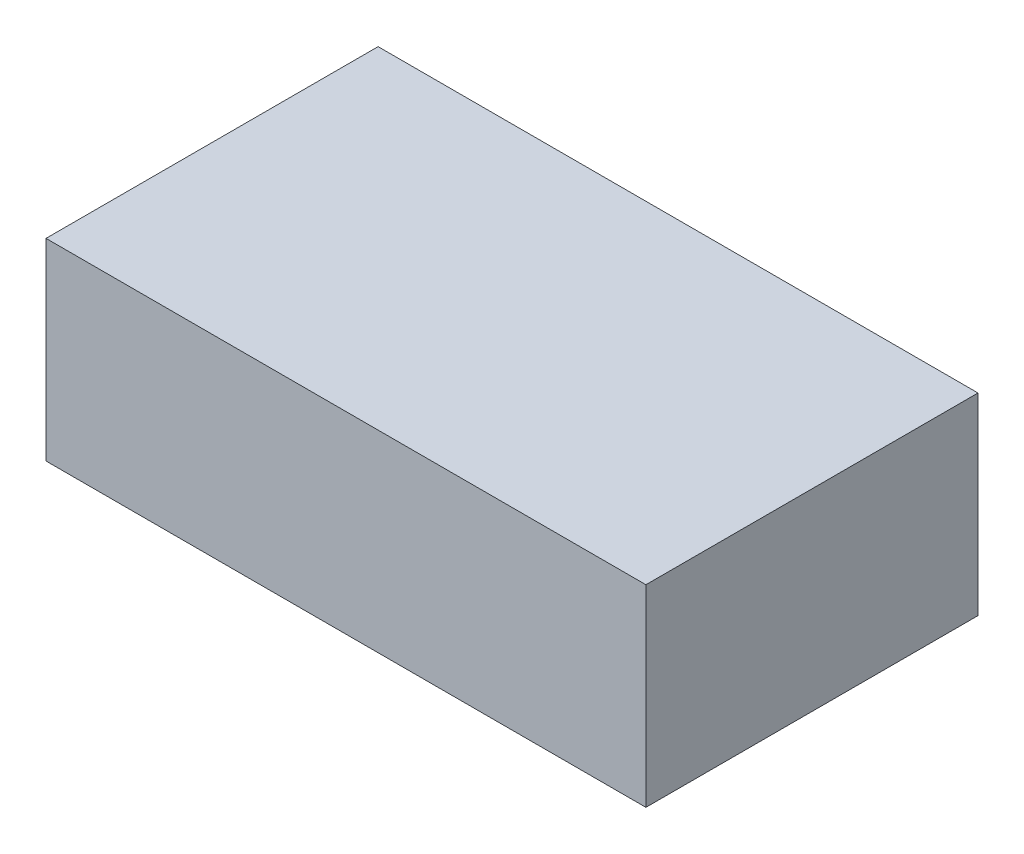
ISO-10303-21;
HEADER;
FILE_DESCRIPTION(('STEP AP214'),'2;1');
FILE_NAME('part.step','',(''),(''),'','','');
FILE_SCHEMA(('AUTOMOTIVE_DESIGN { 1 0 10303 214 1 1 1 1 }'));
ENDSEC;
DATA;
#1=APPLICATION_CONTEXT('core data for automotive mechanical design processes');
#2=APPLICATION_PROTOCOL_DEFINITION('international standard','automotive_design',2000,#1);
#3=PRODUCT_CONTEXT('',#1,'mechanical');
#4=PRODUCT('Part','Part','',(#3));
#5=PRODUCT_RELATED_PRODUCT_CATEGORY('part','',(#4));
#6=PRODUCT_DEFINITION_FORMATION('','',#4);
#7=PRODUCT_DEFINITION_CONTEXT('part definition',#1,'design');
#8=PRODUCT_DEFINITION('design','',#6,#7);
#9=PRODUCT_DEFINITION_SHAPE('','',#8);
#10=(LENGTH_UNIT() NAMED_UNIT(*) SI_UNIT(.MILLI.,.METRE.));
#11=(NAMED_UNIT(*) PLANE_ANGLE_UNIT() SI_UNIT($,.RADIAN.));
#12=(NAMED_UNIT(*) SI_UNIT($,.STERADIAN.) SOLID_ANGLE_UNIT());
#13=UNCERTAINTY_MEASURE_WITH_UNIT(LENGTH_MEASURE(1.E-05),#10,'distance_accuracy_value','');
#14=(GEOMETRIC_REPRESENTATION_CONTEXT(3) GLOBAL_UNCERTAINTY_ASSIGNED_CONTEXT((#13)) GLOBAL_UNIT_ASSIGNED_CONTEXT((#10,
#11,#12)) REPRESENTATION_CONTEXT('',''));
#15=CARTESIAN_POINT('',(0.,0.,0.));
#16=DIRECTION('',(0.,0.,1.));
#17=DIRECTION('',(1.,0.,0.));
#18=AXIS2_PLACEMENT_3D('',#15,#16,#17);
#19=CARTESIAN_POINT('',(0.,18.,-0.515151515151538));
#20=DIRECTION('',(1.,0.,0.));
#21=DIRECTION('',(0.,0.,-1.));
#22=AXIS2_PLACEMENT_3D('',#19,#20,#21);
#23=PLANE('',#22);
#24=DIRECTION('',(0.,0.,1.));
#25=VECTOR('',#24,1.);
#26=CARTESIAN_POINT('',(0.,0.,-0.515151515151538));
#27=LINE('',#26,#25);
#28=CARTESIAN_POINT('',(0.,0.,-31.5151515151515));
#29=VERTEX_POINT('',#28);
#30=CARTESIAN_POINT('',(0.,0.,-0.515151515151538));
#31=VERTEX_POINT('',#30);
#32=EDGE_CURVE('E107',#29,#31,#27,.T.);
#33=ORIENTED_EDGE('',*,*,#32,.T.);
#34=DIRECTION('',(0.,-1.,0.));
#35=VECTOR('',#34,1.);
#36=CARTESIAN_POINT('',(0.,18.,-0.515151515151538));
#37=LINE('',#36,#35);
#38=CARTESIAN_POINT('',(0.,18.,-0.515151515151538));
#39=VERTEX_POINT('',#38);
#40=EDGE_CURVE('E11',#39,#31,#37,.T.);
#41=ORIENTED_EDGE('',*,*,#40,.F.);
#42=DIRECTION('',(0.,0.,1.));
#43=VECTOR('',#42,1.);
#44=CARTESIAN_POINT('',(0.,18.,-0.515151515151538));
#45=LINE('',#44,#43);
#46=CARTESIAN_POINT('',(0.,18.,-31.5151515151515));
#47=VERTEX_POINT('',#46);
#48=EDGE_CURVE('E91',#47,#39,#45,.T.);
#49=ORIENTED_EDGE('',*,*,#48,.F.);
#50=DIRECTION('',(0.,-1.,0.));
#51=VECTOR('',#50,1.);
#52=CARTESIAN_POINT('',(0.,18.,-31.5151515151515));
#53=LINE('',#52,#51);
#54=EDGE_CURVE('E103',#47,#29,#53,.T.);
#55=ORIENTED_EDGE('',*,*,#54,.T.);
#56=EDGE_LOOP('',(#33,#41,#49,#55));
#57=FACE_BOUND('',#56,.T.);
#58=ADVANCED_FACE('F39',(#57),#23,.F.);
#59=CARTESIAN_POINT('',(0.,18.,-0.515151515151538));
#60=DIRECTION('',(0.,0.,-1.));
#61=DIRECTION('',(-1.,0.,0.));
#62=AXIS2_PLACEMENT_3D('',#59,#60,#61);
#63=PLANE('',#62);
#64=DIRECTION('',(1.,0.,0.));
#65=VECTOR('',#64,1.);
#66=CARTESIAN_POINT('',(0.,0.,-0.515151515151538));
#67=LINE('',#66,#65);
#68=CARTESIAN_POINT('',(56.,0.,-0.515151515151538));
#69=VERTEX_POINT('',#68);
#70=EDGE_CURVE('E96',#31,#69,#67,.T.);
#71=ORIENTED_EDGE('',*,*,#70,.T.);
#72=DIRECTION('',(0.,-1.,0.));
#73=VECTOR('',#72,1.);
#74=CARTESIAN_POINT('',(56.,18.,-0.515151515151538));
#75=LINE('',#74,#73);
#76=CARTESIAN_POINT('',(56.,18.,-0.515151515151538));
#77=VERTEX_POINT('',#76);
#78=EDGE_CURVE('E48',#77,#69,#75,.T.);
#79=ORIENTED_EDGE('',*,*,#78,.F.);
#80=DIRECTION('',(1.,0.,0.));
#81=VECTOR('',#80,1.);
#82=CARTESIAN_POINT('',(0.,18.,-0.515151515151538));
#83=LINE('',#82,#81);
#84=EDGE_CURVE('E86',#39,#77,#83,.T.);
#85=ORIENTED_EDGE('',*,*,#84,.F.);
#86=ORIENTED_EDGE('',*,*,#40,.T.);
#87=EDGE_LOOP('',(#71,#79,#85,#86));
#88=FACE_BOUND('',#87,.T.);
#89=ADVANCED_FACE('F95',(#88),#63,.F.);
#90=CARTESIAN_POINT('',(56.,18.,-0.515151515151538));
#91=DIRECTION('',(-1.,0.,0.));
#92=DIRECTION('',(0.,0.,1.));
#93=AXIS2_PLACEMENT_3D('',#90,#91,#92);
#94=PLANE('',#93);
#95=DIRECTION('',(0.,0.,-1.));
#96=VECTOR('',#95,1.);
#97=CARTESIAN_POINT('',(56.,0.,-0.515151515151538));
#98=LINE('',#97,#96);
#99=CARTESIAN_POINT('',(56.,0.,-31.5151515151515));
#100=VERTEX_POINT('',#99);
#101=EDGE_CURVE('E73',#69,#100,#98,.T.);
#102=ORIENTED_EDGE('',*,*,#101,.T.);
#103=DIRECTION('',(0.,-1.,0.));
#104=VECTOR('',#103,1.);
#105=CARTESIAN_POINT('',(56.,18.,-31.5151515151515));
#106=LINE('',#105,#104);
#107=CARTESIAN_POINT('',(56.,18.,-31.5151515151515));
#108=VERTEX_POINT('',#107);
#109=EDGE_CURVE('E98',#108,#100,#106,.T.);
#110=ORIENTED_EDGE('',*,*,#109,.F.);
#111=DIRECTION('',(0.,0.,-1.));
#112=VECTOR('',#111,1.);
#113=CARTESIAN_POINT('',(56.,18.,-0.515151515151538));
#114=LINE('',#113,#112);
#115=EDGE_CURVE('E89',#77,#108,#114,.T.);
#116=ORIENTED_EDGE('',*,*,#115,.F.);
#117=ORIENTED_EDGE('',*,*,#78,.T.);
#118=EDGE_LOOP('',(#102,#110,#116,#117));
#119=FACE_BOUND('',#118,.T.);
#120=ADVANCED_FACE('F99',(#119),#94,.F.);
#121=CARTESIAN_POINT('',(0.,18.,-31.5151515151515));
#122=DIRECTION('',(0.,0.,1.));
#123=DIRECTION('',(1.,0.,0.));
#124=AXIS2_PLACEMENT_3D('',#121,#122,#123);
#125=PLANE('',#124);
#126=DIRECTION('',(-1.,0.,0.));
#127=VECTOR('',#126,1.);
#128=CARTESIAN_POINT('',(0.,0.,-31.5151515151515));
#129=LINE('',#128,#127);
#130=EDGE_CURVE('E79',#100,#29,#129,.T.);
#131=ORIENTED_EDGE('',*,*,#130,.T.);
#132=ORIENTED_EDGE('',*,*,#54,.F.);
#133=DIRECTION('',(-1.,0.,0.));
#134=VECTOR('',#133,1.);
#135=CARTESIAN_POINT('',(0.,18.,-31.5151515151515));
#136=LINE('',#135,#134);
#137=EDGE_CURVE('E56',#108,#47,#136,.T.);
#138=ORIENTED_EDGE('',*,*,#137,.F.);
#139=ORIENTED_EDGE('',*,*,#109,.T.);
#140=EDGE_LOOP('',(#131,#132,#138,#139));
#141=FACE_BOUND('',#140,.T.);
#142=ADVANCED_FACE('F120',(#141),#125,.F.);
#143=CARTESIAN_POINT('',(0.,18.,0.));
#144=DIRECTION('',(0.,-1.,0.));
#145=DIRECTION('',(0.,0.,-1.));
#146=AXIS2_PLACEMENT_3D('',#143,#144,#145);
#147=PLANE('',#146);
#148=ORIENTED_EDGE('',*,*,#48,.T.);
#149=ORIENTED_EDGE('',*,*,#84,.T.);
#150=ORIENTED_EDGE('',*,*,#115,.T.);
#151=ORIENTED_EDGE('',*,*,#137,.T.);
#152=EDGE_LOOP('',(#148,#149,#150,#151));
#153=FACE_BOUND('',#152,.T.);
#154=ADVANCED_FACE('F87',(#153),#147,.F.);
#155=CARTESIAN_POINT('',(0.,0.,0.));
#156=DIRECTION('',(0.,-1.,0.));
#157=DIRECTION('',(0.,0.,-1.));
#158=AXIS2_PLACEMENT_3D('',#155,#156,#157);
#159=PLANE('',#158);
#160=ORIENTED_EDGE('',*,*,#32,.F.);
#161=ORIENTED_EDGE('',*,*,#130,.F.);
#162=ORIENTED_EDGE('',*,*,#101,.F.);
#163=ORIENTED_EDGE('',*,*,#70,.F.);
#164=EDGE_LOOP('',(#160,#161,#162,#163));
#165=FACE_BOUND('',#164,.T.);
#166=ADVANCED_FACE('F123',(#165),#159,.T.);
#167=CLOSED_SHELL('',(#58,#89,#120,#142,#154,#166));
#168=MANIFOLD_SOLID_BREP('B2',#167);
#169=ADVANCED_BREP_SHAPE_REPRESENTATION('',(#18,#168),#14);
#170=SHAPE_DEFINITION_REPRESENTATION(#9,#169);
ENDSEC;
END-ISO-10303-21;
